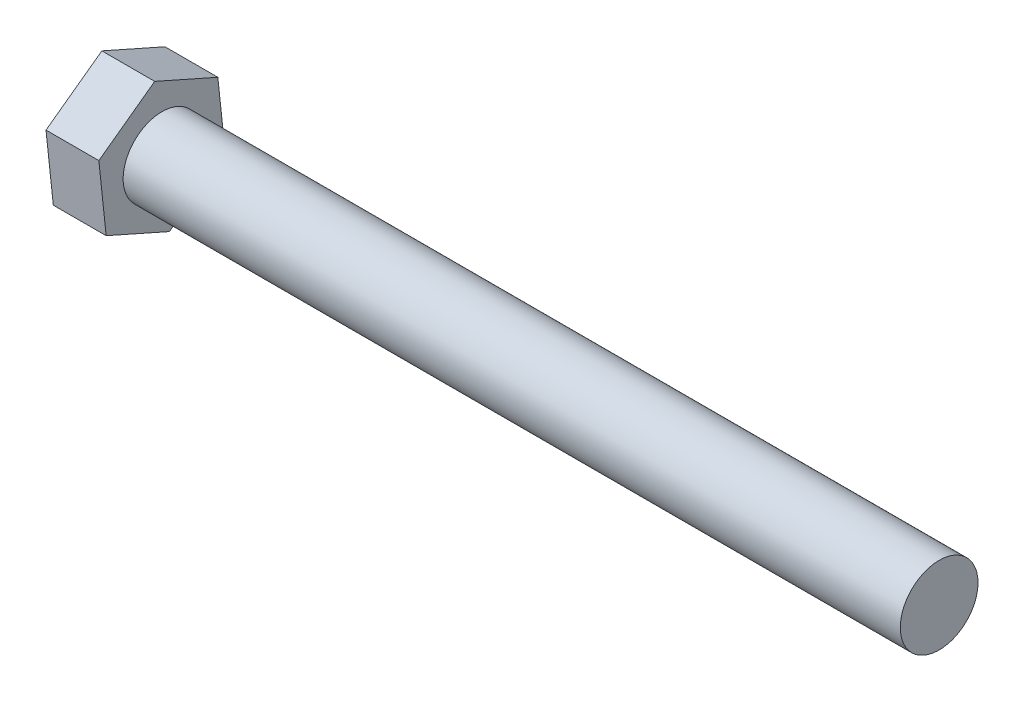
ISO-10303-21;
HEADER;
FILE_DESCRIPTION(('STEP AP214'),'2;1');
FILE_NAME('part.step','',(''),(''),'','','');
FILE_SCHEMA(('AUTOMOTIVE_DESIGN { 1 0 10303 214 1 1 1 1 }'));
ENDSEC;
DATA;
#1=APPLICATION_CONTEXT('core data for automotive mechanical design processes');
#2=APPLICATION_PROTOCOL_DEFINITION('international standard','automotive_design',2000,#1);
#3=PRODUCT_CONTEXT('',#1,'mechanical');
#4=PRODUCT('Part','Part','',(#3));
#5=PRODUCT_RELATED_PRODUCT_CATEGORY('part','',(#4));
#6=PRODUCT_DEFINITION_FORMATION('','',#4);
#7=PRODUCT_DEFINITION_CONTEXT('part definition',#1,'design');
#8=PRODUCT_DEFINITION('design','',#6,#7);
#9=PRODUCT_DEFINITION_SHAPE('','',#8);
#10=(LENGTH_UNIT() NAMED_UNIT(*) SI_UNIT(.MILLI.,.METRE.));
#11=(NAMED_UNIT(*) PLANE_ANGLE_UNIT() SI_UNIT($,.RADIAN.));
#12=(NAMED_UNIT(*) SI_UNIT($,.STERADIAN.) SOLID_ANGLE_UNIT());
#13=UNCERTAINTY_MEASURE_WITH_UNIT(LENGTH_MEASURE(1.E-05),#10,'distance_accuracy_value','');
#14=(GEOMETRIC_REPRESENTATION_CONTEXT(3) GLOBAL_UNCERTAINTY_ASSIGNED_CONTEXT((#13)) GLOBAL_UNIT_ASSIGNED_CONTEXT((#10,
#11,#12)) REPRESENTATION_CONTEXT('',''));
#15=CARTESIAN_POINT('',(0.,0.,0.));
#16=DIRECTION('',(0.,0.,1.));
#17=DIRECTION('',(1.,0.,0.));
#18=AXIS2_PLACEMENT_3D('',#15,#16,#17);
#19=CARTESIAN_POINT('',(3.4,-1.80349986965657,-4.06333872000379));
#20=DIRECTION('',(0.,-0.105675941716801,0.994400621149377));
#21=DIRECTION('',(0.,-0.994400621149377,-0.105675941716801));
#22=AXIS2_PLACEMENT_3D('',#19,#20,#21);
#23=PLANE('',#22);
#24=DIRECTION('',(0.,0.994400621149377,0.105675941716801));
#25=VECTOR('',#24,1.);
#26=CARTESIAN_POINT('',(0.,-1.80349986965657,-4.06333872000379));
#27=LINE('',#26,#25);
#28=CARTESIAN_POINT('',(0.,-1.80349986965657,-4.06333872000379));
#29=VERTEX_POINT('',#28);
#30=CARTESIAN_POINT('',(0.,2.61720462087594,-3.59354606284641));
#31=VERTEX_POINT('',#30);
#32=EDGE_CURVE('E130',#29,#31,#27,.T.);
#33=ORIENTED_EDGE('',*,*,#32,.T.);
#34=DIRECTION('',(-1.,0.,0.));
#35=VECTOR('',#34,1.);
#36=CARTESIAN_POINT('',(3.4,2.61720462087594,-3.59354606284641));
#37=LINE('',#36,#35);
#38=CARTESIAN_POINT('',(3.4,2.61720462087594,-3.59354606284641));
#39=VERTEX_POINT('',#38);
#40=EDGE_CURVE('E42',#39,#31,#37,.T.);
#41=ORIENTED_EDGE('',*,*,#40,.F.);
#42=DIRECTION('',(0.,0.994400621149377,0.105675941716801));
#43=VECTOR('',#42,1.);
#44=CARTESIAN_POINT('',(3.4,-1.80349986965657,-4.06333872000379));
#45=LINE('',#44,#43);
#46=CARTESIAN_POINT('',(3.4,-1.80349986965657,-4.06333872000379));
#47=VERTEX_POINT('',#46);
#48=EDGE_CURVE('E147',#47,#39,#45,.T.);
#49=ORIENTED_EDGE('',*,*,#48,.F.);
#50=DIRECTION('',(-1.,0.,0.));
#51=VECTOR('',#50,1.);
#52=CARTESIAN_POINT('',(3.4,-1.80349986965657,-4.06333872000379));
#53=LINE('',#52,#51);
#54=EDGE_CURVE('E126',#47,#29,#53,.T.);
#55=ORIENTED_EDGE('',*,*,#54,.T.);
#56=EDGE_LOOP('',(#33,#41,#49,#55));
#57=FACE_BOUND('',#56,.T.);
#58=ADVANCED_FACE('F39',(#57),#23,.F.);
#59=CARTESIAN_POINT('',(3.4,2.61720462087594,-3.59354606284641));
#60=DIRECTION('',(0.,-0.914014170312786,0.405682260479095));
#61=DIRECTION('',(0.,-0.405682260479095,-0.914014170312787));
#62=AXIS2_PLACEMENT_3D('',#59,#60,#61);
#63=PLANE('',#62);
#64=DIRECTION('',(0.,0.405682260479095,0.914014170312786));
#65=VECTOR('',#64,1.);
#66=CARTESIAN_POINT('',(0.,2.61720462087594,-3.59354606284641));
#67=LINE('',#66,#65);
#68=CARTESIAN_POINT('',(0.,4.42070449053251,0.469792657157378));
#69=VERTEX_POINT('',#68);
#70=EDGE_CURVE('E134',#31,#69,#67,.T.);
#71=ORIENTED_EDGE('',*,*,#70,.T.);
#72=DIRECTION('',(-1.,0.,0.));
#73=VECTOR('',#72,1.);
#74=CARTESIAN_POINT('',(3.4,4.42070449053251,0.469792657157378));
#75=LINE('',#74,#73);
#76=CARTESIAN_POINT('',(3.4,4.42070449053251,0.469792657157378));
#77=VERTEX_POINT('',#76);
#78=EDGE_CURVE('E153',#77,#69,#75,.T.);
#79=ORIENTED_EDGE('',*,*,#78,.F.);
#80=DIRECTION('',(0.,0.405682260479095,0.914014170312786));
#81=VECTOR('',#80,1.);
#82=CARTESIAN_POINT('',(3.4,2.61720462087594,-3.59354606284641));
#83=LINE('',#82,#81);
#84=EDGE_CURVE('E95',#39,#77,#83,.T.);
#85=ORIENTED_EDGE('',*,*,#84,.F.);
#86=ORIENTED_EDGE('',*,*,#40,.T.);
#87=EDGE_LOOP('',(#71,#79,#85,#86));
#88=FACE_BOUND('',#87,.T.);
#89=ADVANCED_FACE('F160',(#88),#63,.F.);
#90=CARTESIAN_POINT('',(3.4,4.42070449053251,0.469792657157378));
#91=DIRECTION('',(0.,-0.808338228595986,-0.588718360670282));
#92=DIRECTION('',(0.,0.588718360670282,-0.808338228595986));
#93=AXIS2_PLACEMENT_3D('',#90,#91,#92);
#94=PLANE('',#93);
#95=DIRECTION('',(0.,-0.588718360670282,0.808338228595986));
#96=VECTOR('',#95,1.);
#97=CARTESIAN_POINT('',(0.,4.42070449053251,0.469792657157378));
#98=LINE('',#97,#96);
#99=CARTESIAN_POINT('',(0.,1.80349986965657,4.06333872000379));
#100=VERTEX_POINT('',#99);
#101=EDGE_CURVE('E138',#69,#100,#98,.T.);
#102=ORIENTED_EDGE('',*,*,#101,.T.);
#103=DIRECTION('',(-1.,0.,0.));
#104=VECTOR('',#103,1.);
#105=CARTESIAN_POINT('',(3.4,1.80349986965657,4.06333872000379));
#106=LINE('',#105,#104);
#107=CARTESIAN_POINT('',(3.4,1.80349986965657,4.06333872000379));
#108=VERTEX_POINT('',#107);
#109=EDGE_CURVE('E119',#108,#100,#106,.T.);
#110=ORIENTED_EDGE('',*,*,#109,.F.);
#111=DIRECTION('',(0.,-0.588718360670282,0.808338228595986));
#112=VECTOR('',#111,1.);
#113=CARTESIAN_POINT('',(3.4,4.42070449053251,0.469792657157378));
#114=LINE('',#113,#112);
#115=EDGE_CURVE('E108',#77,#108,#114,.T.);
#116=ORIENTED_EDGE('',*,*,#115,.F.);
#117=ORIENTED_EDGE('',*,*,#78,.T.);
#118=EDGE_LOOP('',(#102,#110,#116,#117));
#119=FACE_BOUND('',#118,.T.);
#120=ADVANCED_FACE('F166',(#119),#94,.F.);
#121=CARTESIAN_POINT('',(3.4,1.80349986965657,4.06333872000379));
#122=DIRECTION('',(0.,0.105675941716801,-0.994400621149377));
#123=DIRECTION('',(0.,0.994400621149377,0.105675941716801));
#124=AXIS2_PLACEMENT_3D('',#121,#122,#123);
#125=PLANE('',#124);
#126=DIRECTION('',(0.,-0.994400621149377,-0.105675941716801));
#127=VECTOR('',#126,1.);
#128=CARTESIAN_POINT('',(0.,1.80349986965657,4.06333872000379));
#129=LINE('',#128,#127);
#130=CARTESIAN_POINT('',(0.,-2.61720462087594,3.59354606284641));
#131=VERTEX_POINT('',#130);
#132=EDGE_CURVE('E117',#100,#131,#129,.T.);
#133=ORIENTED_EDGE('',*,*,#132,.T.);
#134=DIRECTION('',(-1.,0.,0.));
#135=VECTOR('',#134,1.);
#136=CARTESIAN_POINT('',(3.4,-2.61720462087594,3.59354606284641));
#137=LINE('',#136,#135);
#138=CARTESIAN_POINT('',(3.4,-2.61720462087594,3.59354606284641));
#139=VERTEX_POINT('',#138);
#140=EDGE_CURVE('E114',#139,#131,#137,.T.);
#141=ORIENTED_EDGE('',*,*,#140,.F.);
#142=DIRECTION('',(0.,-0.994400621149377,-0.105675941716801));
#143=VECTOR('',#142,1.);
#144=CARTESIAN_POINT('',(3.4,1.80349986965657,4.06333872000379));
#145=LINE('',#144,#143);
#146=EDGE_CURVE('E102',#108,#139,#145,.T.);
#147=ORIENTED_EDGE('',*,*,#146,.F.);
#148=ORIENTED_EDGE('',*,*,#109,.T.);
#149=EDGE_LOOP('',(#133,#141,#147,#148));
#150=FACE_BOUND('',#149,.T.);
#151=ADVANCED_FACE('F115',(#150),#125,.F.);
#152=CARTESIAN_POINT('',(3.4,-2.61720462087594,3.59354606284641));
#153=DIRECTION('',(0.,0.914014170312787,-0.405682260479095));
#154=DIRECTION('',(0.,0.405682260479095,0.914014170312787));
#155=AXIS2_PLACEMENT_3D('',#152,#153,#154);
#156=PLANE('',#155);
#157=DIRECTION('',(0.,-0.405682260479095,-0.914014170312787));
#158=VECTOR('',#157,1.);
#159=CARTESIAN_POINT('',(0.,-2.61720462087594,3.59354606284641));
#160=LINE('',#159,#158);
#161=CARTESIAN_POINT('',(0.,-4.42070449053251,-0.469792657157378));
#162=VERTEX_POINT('',#161);
#163=EDGE_CURVE('E80',#131,#162,#160,.T.);
#164=ORIENTED_EDGE('',*,*,#163,.T.);
#165=DIRECTION('',(-1.,0.,0.));
#166=VECTOR('',#165,1.);
#167=CARTESIAN_POINT('',(3.4,-4.42070449053251,-0.469792657157378));
#168=LINE('',#167,#166);
#169=CARTESIAN_POINT('',(3.4,-4.42070449053251,-0.469792657157378));
#170=VERTEX_POINT('',#169);
#171=EDGE_CURVE('E120',#170,#162,#168,.T.);
#172=ORIENTED_EDGE('',*,*,#171,.F.);
#173=DIRECTION('',(0.,-0.405682260479095,-0.914014170312787));
#174=VECTOR('',#173,1.);
#175=CARTESIAN_POINT('',(3.4,-2.61720462087594,3.59354606284641));
#176=LINE('',#175,#174);
#177=EDGE_CURVE('E106',#139,#170,#176,.T.);
#178=ORIENTED_EDGE('',*,*,#177,.F.);
#179=ORIENTED_EDGE('',*,*,#140,.T.);
#180=EDGE_LOOP('',(#164,#172,#178,#179));
#181=FACE_BOUND('',#180,.T.);
#182=ADVANCED_FACE('F122',(#181),#156,.F.);
#183=CARTESIAN_POINT('',(3.4,-4.42070449053251,-0.469792657157378));
#184=DIRECTION('',(0.,0.808338228595985,0.588718360670282));
#185=DIRECTION('',(0.,-0.588718360670282,0.808338228595985));
#186=AXIS2_PLACEMENT_3D('',#183,#184,#185);
#187=PLANE('',#186);
#188=DIRECTION('',(0.,0.588718360670282,-0.808338228595986));
#189=VECTOR('',#188,1.);
#190=CARTESIAN_POINT('',(0.,-4.42070449053251,-0.469792657157378));
#191=LINE('',#190,#189);
#192=EDGE_CURVE('E86',#162,#29,#191,.T.);
#193=ORIENTED_EDGE('',*,*,#192,.T.);
#194=ORIENTED_EDGE('',*,*,#54,.F.);
#195=DIRECTION('',(0.,0.588718360670282,-0.808338228595986));
#196=VECTOR('',#195,1.);
#197=CARTESIAN_POINT('',(3.4,-4.42070449053251,-0.469792657157378));
#198=LINE('',#197,#196);
#199=EDGE_CURVE('E57',#170,#47,#198,.T.);
#200=ORIENTED_EDGE('',*,*,#199,.F.);
#201=ORIENTED_EDGE('',*,*,#171,.T.);
#202=EDGE_LOOP('',(#193,#194,#200,#201));
#203=FACE_BOUND('',#202,.T.);
#204=ADVANCED_FACE('F186',(#203),#187,.F.);
#205=CARTESIAN_POINT('',(3.4,0.,0.));
#206=DIRECTION('',(1.,0.,0.));
#207=DIRECTION('',(0.,0.,-1.));
#208=AXIS2_PLACEMENT_3D('',#205,#206,#207);
#209=PLANE('',#208);
#210=CARTESIAN_POINT('',(3.4,0.,0.));
#211=DIRECTION('',(1.,0.,0.));
#212=DIRECTION('',(0.,0.,-1.));
#213=AXIS2_PLACEMENT_3D('',#210,#211,#212);
#214=CIRCLE('',#213,2.5);
#215=CARTESIAN_POINT('',(3.4,0.,-2.5));
#216=VERTEX_POINT('',#215);
#217=EDGE_CURVE('E11',#216,#216,#214,.T.);
#218=ORIENTED_EDGE('',*,*,#217,.F.);
#219=EDGE_LOOP('',(#218));
#220=FACE_BOUND('',#219,.T.);
#221=ORIENTED_EDGE('',*,*,#48,.T.);
#222=ORIENTED_EDGE('',*,*,#84,.T.);
#223=ORIENTED_EDGE('',*,*,#115,.T.);
#224=ORIENTED_EDGE('',*,*,#146,.T.);
#225=ORIENTED_EDGE('',*,*,#177,.T.);
#226=ORIENTED_EDGE('',*,*,#199,.T.);
#227=EDGE_LOOP('',(#221,#222,#223,#224,#225,#226));
#228=FACE_BOUND('',#227,.T.);
#229=ADVANCED_FACE('F104',(#220,#228),#209,.T.);
#230=CARTESIAN_POINT('',(0.,0.,0.));
#231=DIRECTION('',(1.,0.,0.));
#232=DIRECTION('',(0.,0.,-1.));
#233=AXIS2_PLACEMENT_3D('',#230,#231,#232);
#234=PLANE('',#233);
#235=ORIENTED_EDGE('',*,*,#32,.F.);
#236=ORIENTED_EDGE('',*,*,#192,.F.);
#237=ORIENTED_EDGE('',*,*,#163,.F.);
#238=ORIENTED_EDGE('',*,*,#132,.F.);
#239=ORIENTED_EDGE('',*,*,#101,.F.);
#240=ORIENTED_EDGE('',*,*,#70,.F.);
#241=EDGE_LOOP('',(#235,#236,#237,#238,#239,#240));
#242=FACE_BOUND('',#241,.T.);
#243=ADVANCED_FACE('F165',(#242),#234,.F.);
#244=CARTESIAN_POINT('',(53.4,0.,0.));
#245=DIRECTION('',(-1.,0.,0.));
#246=DIRECTION('',(0.,0.,1.));
#247=AXIS2_PLACEMENT_3D('',#244,#245,#246);
#248=CYLINDRICAL_SURFACE('',#247,2.5);
#249=CARTESIAN_POINT('',(53.4,0.,0.));
#250=DIRECTION('',(1.,0.,0.));
#251=DIRECTION('',(0.,0.,-1.));
#252=AXIS2_PLACEMENT_3D('',#249,#250,#251);
#253=CIRCLE('',#252,2.5);
#254=CARTESIAN_POINT('',(53.4,0.,-2.5));
#255=VERTEX_POINT('',#254);
#256=EDGE_CURVE('E135',#255,#255,#253,.T.);
#257=ORIENTED_EDGE('',*,*,#256,.F.);
#258=EDGE_LOOP('',(#257));
#259=FACE_BOUND('',#258,.T.);
#260=ORIENTED_EDGE('',*,*,#217,.T.);
#261=EDGE_LOOP('',(#260));
#262=FACE_BOUND('',#261,.T.);
#263=ADVANCED_FACE('F179',(#259,#262),#248,.T.);
#264=CARTESIAN_POINT('',(53.4,0.,0.));
#265=DIRECTION('',(1.,0.,0.));
#266=DIRECTION('',(0.,0.,-1.));
#267=AXIS2_PLACEMENT_3D('',#264,#265,#266);
#268=PLANE('',#267);
#269=ORIENTED_EDGE('',*,*,#256,.T.);
#270=EDGE_LOOP('',(#269));
#271=FACE_BOUND('',#270,.T.);
#272=ADVANCED_FACE('F177',(#271),#268,.T.);
#273=CLOSED_SHELL('',(#58,#89,#120,#151,#182,#204,#229,#243,#263,#272));
#274=MANIFOLD_SOLID_BREP('B2',#273);
#275=ADVANCED_BREP_SHAPE_REPRESENTATION('',(#18,#274),#14);
#276=SHAPE_DEFINITION_REPRESENTATION(#9,#275);
ENDSEC;
END-ISO-10303-21;
